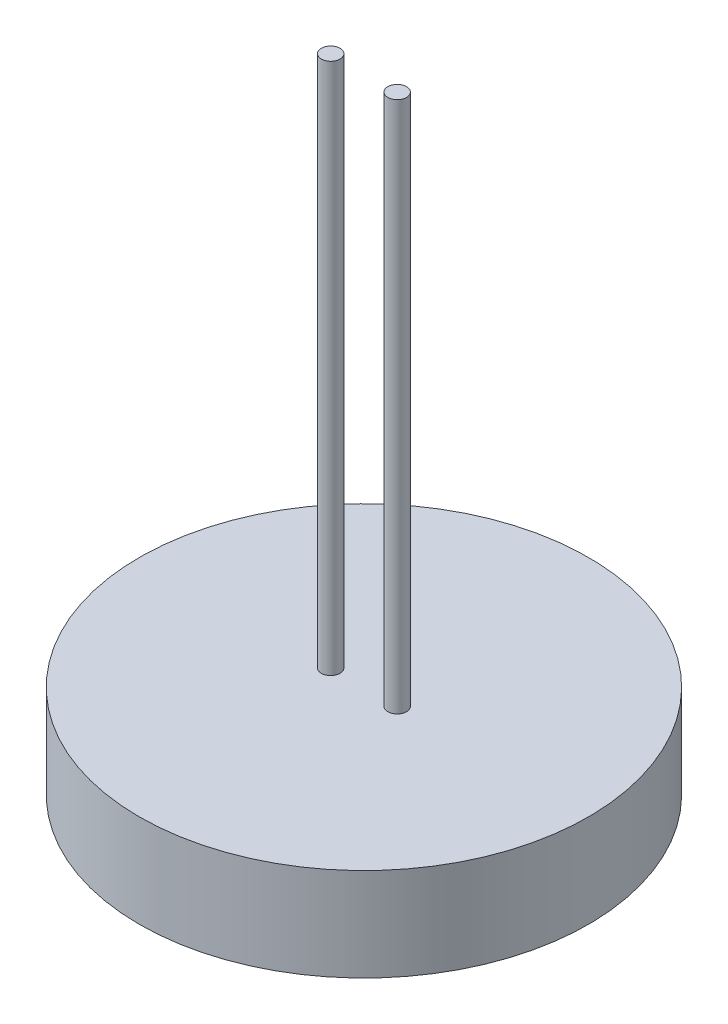
ISO-10303-21;
HEADER;
FILE_DESCRIPTION(('STEP AP214'),'2;1');
FILE_NAME('part.step','',(''),(''),'','','');
FILE_SCHEMA(('AUTOMOTIVE_DESIGN { 1 0 10303 214 1 1 1 1 }'));
ENDSEC;
DATA;
#1=APPLICATION_CONTEXT('core data for automotive mechanical design processes');
#2=APPLICATION_PROTOCOL_DEFINITION('international standard','automotive_design',2000,#1);
#3=PRODUCT_CONTEXT('',#1,'mechanical');
#4=PRODUCT('Part','Part','',(#3));
#5=PRODUCT_RELATED_PRODUCT_CATEGORY('part','',(#4));
#6=PRODUCT_DEFINITION_FORMATION('','',#4);
#7=PRODUCT_DEFINITION_CONTEXT('part definition',#1,'design');
#8=PRODUCT_DEFINITION('design','',#6,#7);
#9=PRODUCT_DEFINITION_SHAPE('','',#8);
#10=(LENGTH_UNIT() NAMED_UNIT(*) SI_UNIT(.MILLI.,.METRE.));
#11=(NAMED_UNIT(*) PLANE_ANGLE_UNIT() SI_UNIT($,.RADIAN.));
#12=(NAMED_UNIT(*) SI_UNIT($,.STERADIAN.) SOLID_ANGLE_UNIT());
#13=UNCERTAINTY_MEASURE_WITH_UNIT(LENGTH_MEASURE(1.E-05),#10,'distance_accuracy_value','');
#14=(GEOMETRIC_REPRESENTATION_CONTEXT(3) GLOBAL_UNCERTAINTY_ASSIGNED_CONTEXT((#13)) GLOBAL_UNIT_ASSIGNED_CONTEXT((#10,
#11,#12)) REPRESENTATION_CONTEXT('',''));
#15=CARTESIAN_POINT('',(0.,0.,0.));
#16=DIRECTION('',(0.,0.,1.));
#17=DIRECTION('',(1.,0.,0.));
#18=AXIS2_PLACEMENT_3D('',#15,#16,#17);
#19=CARTESIAN_POINT('',(0.,7.,0.));
#20=DIRECTION('',(0.,-1.,0.));
#21=DIRECTION('',(0.,0.,-1.));
#22=AXIS2_PLACEMENT_3D('',#19,#20,#21);
#23=CYLINDRICAL_SURFACE('',#22,16.891);
#24=CARTESIAN_POINT('',(0.,7.,0.));
#25=DIRECTION('',(0.,1.,0.));
#26=DIRECTION('',(0.,0.,1.));
#27=AXIS2_PLACEMENT_3D('',#24,#25,#26);
#28=CIRCLE('',#27,16.891);
#29=CARTESIAN_POINT('',(0.,7.,16.891));
#30=VERTEX_POINT('',#29);
#31=EDGE_CURVE('E41',#30,#30,#28,.T.);
#32=ORIENTED_EDGE('',*,*,#31,.F.);
#33=EDGE_LOOP('',(#32));
#34=FACE_BOUND('',#33,.T.);
#35=CARTESIAN_POINT('',(0.,0.,0.));
#36=DIRECTION('',(0.,1.,0.));
#37=DIRECTION('',(0.,0.,1.));
#38=AXIS2_PLACEMENT_3D('',#35,#36,#37);
#39=CIRCLE('',#38,16.891);
#40=CARTESIAN_POINT('',(0.,0.,16.891));
#41=VERTEX_POINT('',#40);
#42=EDGE_CURVE('E56',#41,#41,#39,.T.);
#43=ORIENTED_EDGE('',*,*,#42,.T.);
#44=EDGE_LOOP('',(#43));
#45=FACE_BOUND('',#44,.T.);
#46=ADVANCED_FACE('F29',(#34,#45),#23,.T.);
#47=CARTESIAN_POINT('',(0.,7.,0.));
#48=DIRECTION('',(0.,1.,0.));
#49=DIRECTION('',(0.,0.,1.));
#50=AXIS2_PLACEMENT_3D('',#47,#48,#49);
#51=PLANE('',#50);
#52=CARTESIAN_POINT('',(2.5,7.,0.));
#53=DIRECTION('',(0.,1.,0.));
#54=DIRECTION('',(0.,0.,1.));
#55=AXIS2_PLACEMENT_3D('',#52,#53,#54);
#56=CIRCLE('',#55,0.703637869476712);
#57=CARTESIAN_POINT('',(2.5,7.,0.703637869476712));
#58=VERTEX_POINT('',#57);
#59=EDGE_CURVE('E10',#58,#58,#56,.T.);
#60=ORIENTED_EDGE('',*,*,#59,.F.);
#61=EDGE_LOOP('',(#60));
#62=FACE_BOUND('',#61,.T.);
#63=CARTESIAN_POINT('',(-2.5,7.,0.));
#64=DIRECTION('',(0.,1.,0.));
#65=DIRECTION('',(0.,0.,1.));
#66=AXIS2_PLACEMENT_3D('',#63,#64,#65);
#67=CIRCLE('',#66,0.703637869476713);
#68=CARTESIAN_POINT('',(-2.5,7.,0.703637869476713));
#69=VERTEX_POINT('',#68);
#70=EDGE_CURVE('E36',#69,#69,#67,.T.);
#71=ORIENTED_EDGE('',*,*,#70,.F.);
#72=EDGE_LOOP('',(#71));
#73=FACE_BOUND('',#72,.T.);
#74=ORIENTED_EDGE('',*,*,#31,.T.);
#75=EDGE_LOOP('',(#74));
#76=FACE_BOUND('',#75,.T.);
#77=ADVANCED_FACE('F80',(#62,#73,#76),#51,.T.);
#78=CARTESIAN_POINT('',(0.,0.,0.));
#79=DIRECTION('',(0.,1.,0.));
#80=DIRECTION('',(0.,0.,1.));
#81=AXIS2_PLACEMENT_3D('',#78,#79,#80);
#82=PLANE('',#81);
#83=CARTESIAN_POINT('',(2.5,0.,0.));
#84=DIRECTION('',(0.,1.,0.));
#85=DIRECTION('',(0.,0.,1.));
#86=AXIS2_PLACEMENT_3D('',#83,#84,#85);
#87=CIRCLE('',#86,0.703637869476712);
#88=CARTESIAN_POINT('',(2.5,0.,0.703637869476712));
#89=VERTEX_POINT('',#88);
#90=EDGE_CURVE('E32',#89,#89,#87,.T.);
#91=ORIENTED_EDGE('',*,*,#90,.T.);
#92=EDGE_LOOP('',(#91));
#93=FACE_BOUND('',#92,.T.);
#94=CARTESIAN_POINT('',(-2.5,0.,0.));
#95=DIRECTION('',(0.,1.,0.));
#96=DIRECTION('',(0.,0.,1.));
#97=AXIS2_PLACEMENT_3D('',#94,#95,#96);
#98=CIRCLE('',#97,0.703637869476713);
#99=CARTESIAN_POINT('',(-2.5,0.,0.703637869476713));
#100=VERTEX_POINT('',#99);
#101=EDGE_CURVE('E52',#100,#100,#98,.T.);
#102=ORIENTED_EDGE('',*,*,#101,.T.);
#103=EDGE_LOOP('',(#102));
#104=FACE_BOUND('',#103,.T.);
#105=ORIENTED_EDGE('',*,*,#42,.F.);
#106=EDGE_LOOP('',(#105));
#107=FACE_BOUND('',#106,.T.);
#108=ADVANCED_FACE('F61',(#93,#104,#107),#82,.F.);
#109=CARTESIAN_POINT('',(-2.5,-10.,0.));
#110=DIRECTION('',(0.,1.,0.));
#111=DIRECTION('',(0.,0.,1.));
#112=AXIS2_PLACEMENT_3D('',#109,#110,#111);
#113=PLANE('',#112);
#114=CARTESIAN_POINT('',(-2.5,-10.,0.));
#115=DIRECTION('',(0.,1.,0.));
#116=DIRECTION('',(0.,0.,1.));
#117=AXIS2_PLACEMENT_3D('',#114,#115,#116);
#118=CIRCLE('',#117,0.703637869476713);
#119=CARTESIAN_POINT('',(-2.5,-10.,0.703637869476713));
#120=VERTEX_POINT('',#119);
#121=EDGE_CURVE('E50',#120,#120,#118,.T.);
#122=ORIENTED_EDGE('',*,*,#121,.F.);
#123=EDGE_LOOP('',(#122));
#124=FACE_BOUND('',#123,.T.);
#125=ADVANCED_FACE('F67',(#124),#113,.F.);
#126=CARTESIAN_POINT('',(-2.5,-10.,0.));
#127=DIRECTION('',(0.,1.,0.));
#128=DIRECTION('',(0.,0.,1.));
#129=AXIS2_PLACEMENT_3D('',#126,#127,#128);
#130=CYLINDRICAL_SURFACE('',#129,0.703637869476713);
#131=ORIENTED_EDGE('',*,*,#121,.T.);
#132=EDGE_LOOP('',(#131));
#133=FACE_BOUND('',#132,.T.);
#134=ORIENTED_EDGE('',*,*,#101,.F.);
#135=EDGE_LOOP('',(#134));
#136=FACE_BOUND('',#135,.T.);
#137=ADVANCED_FACE('F64',(#133,#136),#130,.T.);
#138=ORIENTED_EDGE('',*,*,#70,.T.);
#139=EDGE_LOOP('',(#138));
#140=FACE_BOUND('',#139,.T.);
#141=CARTESIAN_POINT('',(-2.5,47.,0.));
#142=DIRECTION('',(0.,1.,0.));
#143=DIRECTION('',(0.,0.,1.));
#144=AXIS2_PLACEMENT_3D('',#141,#142,#143);
#145=CIRCLE('',#144,0.703637869476713);
#146=CARTESIAN_POINT('',(-2.5,47.,0.703637869476713));
#147=VERTEX_POINT('',#146);
#148=EDGE_CURVE('E47',#147,#147,#145,.T.);
#149=ORIENTED_EDGE('',*,*,#148,.F.);
#150=EDGE_LOOP('',(#149));
#151=FACE_BOUND('',#150,.T.);
#152=ADVANCED_FACE('F66',(#140,#151),#130,.T.);
#153=CARTESIAN_POINT('',(-2.5,47.,0.));
#154=DIRECTION('',(0.,1.,0.));
#155=DIRECTION('',(0.,0.,1.));
#156=AXIS2_PLACEMENT_3D('',#153,#154,#155);
#157=PLANE('',#156);
#158=ORIENTED_EDGE('',*,*,#148,.T.);
#159=EDGE_LOOP('',(#158));
#160=FACE_BOUND('',#159,.T.);
#161=ADVANCED_FACE('F74',(#160),#157,.T.);
#162=CARTESIAN_POINT('',(2.5,-10.,0.));
#163=DIRECTION('',(0.,1.,0.));
#164=DIRECTION('',(0.,0.,1.));
#165=AXIS2_PLACEMENT_3D('',#162,#163,#164);
#166=PLANE('',#165);
#167=CARTESIAN_POINT('',(2.5,-10.,0.));
#168=DIRECTION('',(0.,1.,0.));
#169=DIRECTION('',(0.,0.,1.));
#170=AXIS2_PLACEMENT_3D('',#167,#168,#169);
#171=CIRCLE('',#170,0.703637869476712);
#172=CARTESIAN_POINT('',(2.5,-10.,0.703637869476712));
#173=VERTEX_POINT('',#172);
#174=EDGE_CURVE('E45',#173,#173,#171,.T.);
#175=ORIENTED_EDGE('',*,*,#174,.F.);
#176=EDGE_LOOP('',(#175));
#177=FACE_BOUND('',#176,.T.);
#178=ADVANCED_FACE('F114',(#177),#166,.F.);
#179=CARTESIAN_POINT('',(2.5,-10.,0.));
#180=DIRECTION('',(0.,1.,0.));
#181=DIRECTION('',(0.,0.,1.));
#182=AXIS2_PLACEMENT_3D('',#179,#180,#181);
#183=CYLINDRICAL_SURFACE('',#182,0.703637869476712);
#184=ORIENTED_EDGE('',*,*,#174,.T.);
#185=EDGE_LOOP('',(#184));
#186=FACE_BOUND('',#185,.T.);
#187=ORIENTED_EDGE('',*,*,#90,.F.);
#188=EDGE_LOOP('',(#187));
#189=FACE_BOUND('',#188,.T.);
#190=ADVANCED_FACE('F107',(#186,#189),#183,.T.);
#191=ORIENTED_EDGE('',*,*,#59,.T.);
#192=EDGE_LOOP('',(#191));
#193=FACE_BOUND('',#192,.T.);
#194=CARTESIAN_POINT('',(2.5,47.,0.));
#195=DIRECTION('',(0.,1.,0.));
#196=DIRECTION('',(0.,0.,1.));
#197=AXIS2_PLACEMENT_3D('',#194,#195,#196);
#198=CIRCLE('',#197,0.703637869476712);
#199=CARTESIAN_POINT('',(2.5,47.,0.703637869476712));
#200=VERTEX_POINT('',#199);
#201=EDGE_CURVE('E97',#200,#200,#198,.T.);
#202=ORIENTED_EDGE('',*,*,#201,.F.);
#203=EDGE_LOOP('',(#202));
#204=FACE_BOUND('',#203,.T.);
#205=ADVANCED_FACE('F105',(#193,#204),#183,.T.);
#206=CARTESIAN_POINT('',(2.5,47.,0.));
#207=DIRECTION('',(0.,1.,0.));
#208=DIRECTION('',(0.,0.,1.));
#209=AXIS2_PLACEMENT_3D('',#206,#207,#208);
#210=PLANE('',#209);
#211=ORIENTED_EDGE('',*,*,#201,.T.);
#212=EDGE_LOOP('',(#211));
#213=FACE_BOUND('',#212,.T.);
#214=ADVANCED_FACE('F103',(#213),#210,.T.);
#215=CLOSED_SHELL('',(#46,#77,#108,#125,#137,#152,#161,#178,#190,#205,#214));
#216=MANIFOLD_SOLID_BREP('B2',#215);
#217=ADVANCED_BREP_SHAPE_REPRESENTATION('',(#18,#216),#14);
#218=SHAPE_DEFINITION_REPRESENTATION(#9,#217);
ENDSEC;
END-ISO-10303-21;
